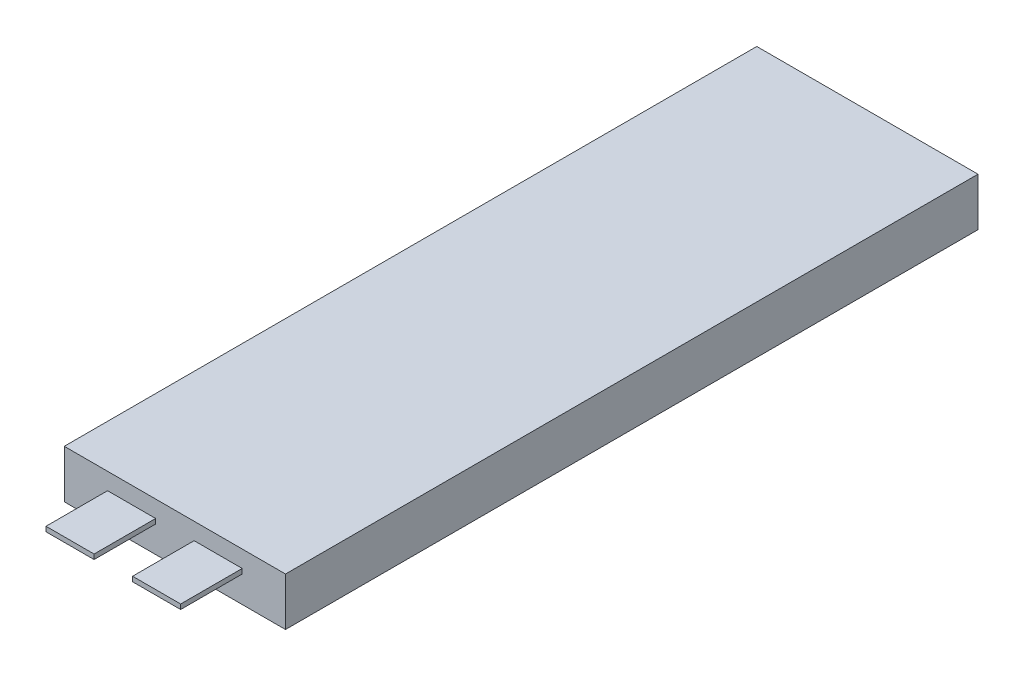
ISO-10303-21;
HEADER;
FILE_DESCRIPTION(('STEP AP214'),'2;1');
FILE_NAME('part.step','',(''),(''),'','','');
FILE_SCHEMA(('AUTOMOTIVE_DESIGN { 1 0 10303 214 1 1 1 1 }'));
ENDSEC;
DATA;
#1=APPLICATION_CONTEXT('core data for automotive mechanical design processes');
#2=APPLICATION_PROTOCOL_DEFINITION('international standard','automotive_design',2000,#1);
#3=PRODUCT_CONTEXT('',#1,'mechanical');
#4=PRODUCT('Part','Part','',(#3));
#5=PRODUCT_RELATED_PRODUCT_CATEGORY('part','',(#4));
#6=PRODUCT_DEFINITION_FORMATION('','',#4);
#7=PRODUCT_DEFINITION_CONTEXT('part definition',#1,'design');
#8=PRODUCT_DEFINITION('design','',#6,#7);
#9=PRODUCT_DEFINITION_SHAPE('','',#8);
#10=(LENGTH_UNIT() NAMED_UNIT(*) SI_UNIT(.MILLI.,.METRE.));
#11=(NAMED_UNIT(*) PLANE_ANGLE_UNIT() SI_UNIT($,.RADIAN.));
#12=(NAMED_UNIT(*) SI_UNIT($,.STERADIAN.) SOLID_ANGLE_UNIT());
#13=UNCERTAINTY_MEASURE_WITH_UNIT(LENGTH_MEASURE(1.E-05),#10,'distance_accuracy_value','');
#14=(GEOMETRIC_REPRESENTATION_CONTEXT(3) GLOBAL_UNCERTAINTY_ASSIGNED_CONTEXT((#13)) GLOBAL_UNIT_ASSIGNED_CONTEXT((#10,
#11,#12)) REPRESENTATION_CONTEXT('',''));
#15=CARTESIAN_POINT('',(0.,0.,0.));
#16=DIRECTION('',(0.,0.,1.));
#17=DIRECTION('',(1.,0.,0.));
#18=AXIS2_PLACEMENT_3D('',#15,#16,#17);
#19=CARTESIAN_POINT('',(23.,10.,72.));
#20=DIRECTION('',(0.,0.,1.));
#21=DIRECTION('',(1.,0.,0.));
#22=AXIS2_PLACEMENT_3D('',#19,#20,#21);
#23=PLANE('',#22);
#24=DIRECTION('',(-1.,0.,0.));
#25=VECTOR('',#24,1.);
#26=CARTESIAN_POINT('',(23.,0.,72.));
#27=LINE('',#26,#25);
#28=CARTESIAN_POINT('',(23.,0.,72.));
#29=VERTEX_POINT('',#28);
#30=CARTESIAN_POINT('',(-23.,0.,72.));
#31=VERTEX_POINT('',#30);
#32=EDGE_CURVE('E209',#29,#31,#27,.T.);
#33=ORIENTED_EDGE('',*,*,#32,.F.);
#34=DIRECTION('',(0.,-1.,0.));
#35=VECTOR('',#34,1.);
#36=CARTESIAN_POINT('',(23.,10.,72.));
#37=LINE('',#36,#35);
#38=CARTESIAN_POINT('',(23.,10.,72.));
#39=VERTEX_POINT('',#38);
#40=EDGE_CURVE('E49',#39,#29,#37,.T.);
#41=ORIENTED_EDGE('',*,*,#40,.F.);
#42=DIRECTION('',(-1.,0.,0.));
#43=VECTOR('',#42,1.);
#44=CARTESIAN_POINT('',(23.,10.,72.));
#45=LINE('',#44,#43);
#46=CARTESIAN_POINT('',(-23.,10.,72.));
#47=VERTEX_POINT('',#46);
#48=EDGE_CURVE('E216',#39,#47,#45,.T.);
#49=ORIENTED_EDGE('',*,*,#48,.T.);
#50=DIRECTION('',(0.,-1.,0.));
#51=VECTOR('',#50,1.);
#52=CARTESIAN_POINT('',(-23.,10.,72.));
#53=LINE('',#52,#51);
#54=EDGE_CURVE('E11',#47,#31,#53,.T.);
#55=ORIENTED_EDGE('',*,*,#54,.T.);
#56=EDGE_LOOP('',(#33,#41,#49,#55));
#57=FACE_BOUND('',#56,.T.);
#58=DIRECTION('',(1.,0.,0.));
#59=VECTOR('',#58,1.);
#60=CARTESIAN_POINT('',(-14.,5.5,72.));
#61=LINE('',#60,#59);
#62=CARTESIAN_POINT('',(-14.,5.5,72.));
#63=VERTEX_POINT('',#62);
#64=CARTESIAN_POINT('',(-4.,5.49999999999999,72.));
#65=VERTEX_POINT('',#64);
#66=EDGE_CURVE('E164',#63,#65,#61,.T.);
#67=ORIENTED_EDGE('',*,*,#66,.F.);
#68=DIRECTION('',(0.,-1.,0.));
#69=VECTOR('',#68,1.);
#70=CARTESIAN_POINT('',(-14.,5.5,72.));
#71=LINE('',#70,#69);
#72=CARTESIAN_POINT('',(-14.,6.5,72.));
#73=VERTEX_POINT('',#72);
#74=EDGE_CURVE('E159',#73,#63,#71,.T.);
#75=ORIENTED_EDGE('',*,*,#74,.F.);
#76=DIRECTION('',(-1.,0.,0.));
#77=VECTOR('',#76,1.);
#78=CARTESIAN_POINT('',(-14.,6.5,72.));
#79=LINE('',#78,#77);
#80=CARTESIAN_POINT('',(-4.,6.5,72.));
#81=VERTEX_POINT('',#80);
#82=EDGE_CURVE('E174',#81,#73,#79,.T.);
#83=ORIENTED_EDGE('',*,*,#82,.F.);
#84=DIRECTION('',(0.,1.,0.));
#85=VECTOR('',#84,1.);
#86=CARTESIAN_POINT('',(-4.,5.49999999999999,72.));
#87=LINE('',#86,#85);
#88=EDGE_CURVE('E186',#65,#81,#87,.T.);
#89=ORIENTED_EDGE('',*,*,#88,.F.);
#90=EDGE_LOOP('',(#67,#75,#83,#89));
#91=FACE_BOUND('',#90,.T.);
#92=DIRECTION('',(0.,1.,0.));
#93=VECTOR('',#92,1.);
#94=CARTESIAN_POINT('',(14.,5.5,72.));
#95=LINE('',#94,#93);
#96=CARTESIAN_POINT('',(14.,5.5,72.));
#97=VERTEX_POINT('',#96);
#98=CARTESIAN_POINT('',(14.,6.5,72.));
#99=VERTEX_POINT('',#98);
#100=EDGE_CURVE('E405',#97,#99,#95,.T.);
#101=ORIENTED_EDGE('',*,*,#100,.F.);
#102=DIRECTION('',(1.,0.,0.));
#103=VECTOR('',#102,1.);
#104=CARTESIAN_POINT('',(14.,5.5,72.));
#105=LINE('',#104,#103);
#106=CARTESIAN_POINT('',(4.,5.49999999999999,72.));
#107=VERTEX_POINT('',#106);
#108=EDGE_CURVE('E156',#107,#97,#105,.T.);
#109=ORIENTED_EDGE('',*,*,#108,.F.);
#110=DIRECTION('',(0.,-1.,0.));
#111=VECTOR('',#110,1.);
#112=CARTESIAN_POINT('',(4.,5.49999999999999,72.));
#113=LINE('',#112,#111);
#114=CARTESIAN_POINT('',(4.,6.5,72.));
#115=VERTEX_POINT('',#114);
#116=EDGE_CURVE('E152',#115,#107,#113,.T.);
#117=ORIENTED_EDGE('',*,*,#116,.F.);
#118=DIRECTION('',(-1.,0.,0.));
#119=VECTOR('',#118,1.);
#120=CARTESIAN_POINT('',(14.,6.5,72.));
#121=LINE('',#120,#119);
#122=EDGE_CURVE('E401',#99,#115,#121,.T.);
#123=ORIENTED_EDGE('',*,*,#122,.F.);
#124=EDGE_LOOP('',(#101,#109,#117,#123));
#125=FACE_BOUND('',#124,.T.);
#126=ADVANCED_FACE('F39',(#57,#91,#125),#23,.T.);
#127=CARTESIAN_POINT('',(-23.,10.,72.));
#128=DIRECTION('',(-1.,0.,0.));
#129=DIRECTION('',(0.,0.,1.));
#130=AXIS2_PLACEMENT_3D('',#127,#128,#129);
#131=PLANE('',#130);
#132=DIRECTION('',(0.,0.,-1.));
#133=VECTOR('',#132,1.);
#134=CARTESIAN_POINT('',(-23.,0.,72.));
#135=LINE('',#134,#133);
#136=CARTESIAN_POINT('',(-23.,0.,-72.));
#137=VERTEX_POINT('',#136);
#138=EDGE_CURVE('E203',#31,#137,#135,.T.);
#139=ORIENTED_EDGE('',*,*,#138,.F.);
#140=ORIENTED_EDGE('',*,*,#54,.F.);
#141=DIRECTION('',(0.,0.,-1.));
#142=VECTOR('',#141,1.);
#143=CARTESIAN_POINT('',(-23.,10.,72.));
#144=LINE('',#143,#142);
#145=CARTESIAN_POINT('',(-23.,10.,-72.));
#146=VERTEX_POINT('',#145);
#147=EDGE_CURVE('E204',#47,#146,#144,.T.);
#148=ORIENTED_EDGE('',*,*,#147,.T.);
#149=DIRECTION('',(0.,-1.,0.));
#150=VECTOR('',#149,1.);
#151=CARTESIAN_POINT('',(-23.,10.,-72.));
#152=LINE('',#151,#150);
#153=EDGE_CURVE('E43',#146,#137,#152,.T.);
#154=ORIENTED_EDGE('',*,*,#153,.T.);
#155=EDGE_LOOP('',(#139,#140,#148,#154));
#156=FACE_BOUND('',#155,.T.);
#157=ADVANCED_FACE('F41',(#156),#131,.T.);
#158=CARTESIAN_POINT('',(23.,10.,72.));
#159=DIRECTION('',(-1.,0.,0.));
#160=DIRECTION('',(0.,0.,1.));
#161=AXIS2_PLACEMENT_3D('',#158,#159,#160);
#162=PLANE('',#161);
#163=DIRECTION('',(0.,0.,-1.));
#164=VECTOR('',#163,1.);
#165=CARTESIAN_POINT('',(23.,0.,72.));
#166=LINE('',#165,#164);
#167=CARTESIAN_POINT('',(23.,0.,-72.));
#168=VERTEX_POINT('',#167);
#169=EDGE_CURVE('E227',#29,#168,#166,.T.);
#170=ORIENTED_EDGE('',*,*,#169,.T.);
#171=DIRECTION('',(0.,-1.,0.));
#172=VECTOR('',#171,1.);
#173=CARTESIAN_POINT('',(23.,10.,-72.));
#174=LINE('',#173,#172);
#175=CARTESIAN_POINT('',(23.,10.,-72.));
#176=VERTEX_POINT('',#175);
#177=EDGE_CURVE('E235',#176,#168,#174,.T.);
#178=ORIENTED_EDGE('',*,*,#177,.F.);
#179=DIRECTION('',(0.,0.,-1.));
#180=VECTOR('',#179,1.);
#181=CARTESIAN_POINT('',(23.,10.,72.));
#182=LINE('',#181,#180);
#183=EDGE_CURVE('E213',#39,#176,#182,.T.);
#184=ORIENTED_EDGE('',*,*,#183,.F.);
#185=ORIENTED_EDGE('',*,*,#40,.T.);
#186=EDGE_LOOP('',(#170,#178,#184,#185));
#187=FACE_BOUND('',#186,.T.);
#188=ADVANCED_FACE('F257',(#187),#162,.F.);
#189=CARTESIAN_POINT('',(-23.,10.,-72.));
#190=DIRECTION('',(0.,0.,-1.));
#191=DIRECTION('',(-1.,0.,0.));
#192=AXIS2_PLACEMENT_3D('',#189,#190,#191);
#193=PLANE('',#192);
#194=DIRECTION('',(1.,0.,0.));
#195=VECTOR('',#194,1.);
#196=CARTESIAN_POINT('',(-23.,0.,-72.));
#197=LINE('',#196,#195);
#198=EDGE_CURVE('E223',#137,#168,#197,.T.);
#199=ORIENTED_EDGE('',*,*,#198,.F.);
#200=ORIENTED_EDGE('',*,*,#153,.F.);
#201=DIRECTION('',(1.,0.,0.));
#202=VECTOR('',#201,1.);
#203=CARTESIAN_POINT('',(-23.,10.,-72.));
#204=LINE('',#203,#202);
#205=EDGE_CURVE('E208',#146,#176,#204,.T.);
#206=ORIENTED_EDGE('',*,*,#205,.T.);
#207=ORIENTED_EDGE('',*,*,#177,.T.);
#208=EDGE_LOOP('',(#199,#200,#206,#207));
#209=FACE_BOUND('',#208,.T.);
#210=ADVANCED_FACE('F245',(#209),#193,.T.);
#211=CARTESIAN_POINT('',(0.,10.,0.));
#212=DIRECTION('',(0.,-1.,0.));
#213=DIRECTION('',(0.,0.,-1.));
#214=AXIS2_PLACEMENT_3D('',#211,#212,#213);
#215=PLANE('',#214);
#216=ORIENTED_EDGE('',*,*,#147,.F.);
#217=ORIENTED_EDGE('',*,*,#48,.F.);
#218=ORIENTED_EDGE('',*,*,#183,.T.);
#219=ORIENTED_EDGE('',*,*,#205,.F.);
#220=EDGE_LOOP('',(#216,#217,#218,#219));
#221=FACE_BOUND('',#220,.T.);
#222=ADVANCED_FACE('F255',(#221),#215,.F.);
#223=CARTESIAN_POINT('',(0.,0.,0.));
#224=DIRECTION('',(0.,-1.,0.));
#225=DIRECTION('',(0.,0.,-1.));
#226=AXIS2_PLACEMENT_3D('',#223,#224,#225);
#227=PLANE('',#226);
#228=ORIENTED_EDGE('',*,*,#138,.T.);
#229=ORIENTED_EDGE('',*,*,#198,.T.);
#230=ORIENTED_EDGE('',*,*,#169,.F.);
#231=ORIENTED_EDGE('',*,*,#32,.T.);
#232=EDGE_LOOP('',(#228,#229,#230,#231));
#233=FACE_BOUND('',#232,.T.);
#234=ADVANCED_FACE('F248',(#233),#227,.T.);
#235=CARTESIAN_POINT('',(-14.,5.5,84.8));
#236=DIRECTION('',(1.,0.,0.));
#237=DIRECTION('',(0.,0.,-1.));
#238=AXIS2_PLACEMENT_3D('',#235,#236,#237);
#239=PLANE('',#238);
#240=ORIENTED_EDGE('',*,*,#74,.T.);
#241=DIRECTION('',(0.,0.,-1.));
#242=VECTOR('',#241,1.);
#243=CARTESIAN_POINT('',(-14.,5.5,84.8));
#244=LINE('',#243,#242);
#245=CARTESIAN_POINT('',(-14.,5.5,84.8));
#246=VERTEX_POINT('',#245);
#247=EDGE_CURVE('E200',#246,#63,#244,.T.);
#248=ORIENTED_EDGE('',*,*,#247,.F.);
#249=DIRECTION('',(0.,-1.,0.));
#250=VECTOR('',#249,1.);
#251=CARTESIAN_POINT('',(-14.,5.5,84.8));
#252=LINE('',#251,#250);
#253=CARTESIAN_POINT('',(-14.,6.5,84.8));
#254=VERTEX_POINT('',#253);
#255=EDGE_CURVE('E169',#254,#246,#252,.T.);
#256=ORIENTED_EDGE('',*,*,#255,.F.);
#257=DIRECTION('',(0.,0.,-1.));
#258=VECTOR('',#257,1.);
#259=CARTESIAN_POINT('',(-14.,6.5,84.8));
#260=LINE('',#259,#258);
#261=EDGE_CURVE('E182',#254,#73,#260,.T.);
#262=ORIENTED_EDGE('',*,*,#261,.T.);
#263=EDGE_LOOP('',(#240,#248,#256,#262));
#264=FACE_BOUND('',#263,.T.);
#265=ADVANCED_FACE('F273',(#264),#239,.F.);
#266=CARTESIAN_POINT('',(-14.,5.5,84.8));
#267=DIRECTION('',(0.,1.,0.));
#268=DIRECTION('',(-1.,0.,0.));
#269=AXIS2_PLACEMENT_3D('',#266,#267,#268);
#270=PLANE('',#269);
#271=ORIENTED_EDGE('',*,*,#66,.T.);
#272=DIRECTION('',(0.,0.,-1.));
#273=VECTOR('',#272,1.);
#274=CARTESIAN_POINT('',(-4.,5.49999999999999,84.8));
#275=LINE('',#274,#273);
#276=CARTESIAN_POINT('',(-4.,5.49999999999999,84.8));
#277=VERTEX_POINT('',#276);
#278=EDGE_CURVE('E196',#277,#65,#275,.T.);
#279=ORIENTED_EDGE('',*,*,#278,.F.);
#280=DIRECTION('',(1.,0.,0.));
#281=VECTOR('',#280,1.);
#282=CARTESIAN_POINT('',(-14.,5.5,84.8));
#283=LINE('',#282,#281);
#284=EDGE_CURVE('E173',#246,#277,#283,.T.);
#285=ORIENTED_EDGE('',*,*,#284,.F.);
#286=ORIENTED_EDGE('',*,*,#247,.T.);
#287=EDGE_LOOP('',(#271,#279,#285,#286));
#288=FACE_BOUND('',#287,.T.);
#289=ADVANCED_FACE('F278',(#288),#270,.F.);
#290=CARTESIAN_POINT('',(-4.,5.49999999999999,84.8));
#291=DIRECTION('',(-1.,0.,0.));
#292=DIRECTION('',(0.,0.,1.));
#293=AXIS2_PLACEMENT_3D('',#290,#291,#292);
#294=PLANE('',#293);
#295=ORIENTED_EDGE('',*,*,#88,.T.);
#296=DIRECTION('',(0.,0.,-1.));
#297=VECTOR('',#296,1.);
#298=CARTESIAN_POINT('',(-4.,6.5,84.8));
#299=LINE('',#298,#297);
#300=CARTESIAN_POINT('',(-4.,6.5,84.8));
#301=VERTEX_POINT('',#300);
#302=EDGE_CURVE('E65',#301,#81,#299,.T.);
#303=ORIENTED_EDGE('',*,*,#302,.F.);
#304=DIRECTION('',(0.,1.,0.));
#305=VECTOR('',#304,1.);
#306=CARTESIAN_POINT('',(-4.,5.49999999999999,84.8));
#307=LINE('',#306,#305);
#308=EDGE_CURVE('E177',#277,#301,#307,.T.);
#309=ORIENTED_EDGE('',*,*,#308,.F.);
#310=ORIENTED_EDGE('',*,*,#278,.T.);
#311=EDGE_LOOP('',(#295,#303,#309,#310));
#312=FACE_BOUND('',#311,.T.);
#313=ADVANCED_FACE('F282',(#312),#294,.F.);
#314=CARTESIAN_POINT('',(-14.,6.5,84.8));
#315=DIRECTION('',(0.,-1.,0.));
#316=DIRECTION('',(1.,0.,0.));
#317=AXIS2_PLACEMENT_3D('',#314,#315,#316);
#318=PLANE('',#317);
#319=ORIENTED_EDGE('',*,*,#82,.T.);
#320=ORIENTED_EDGE('',*,*,#261,.F.);
#321=DIRECTION('',(-1.,0.,0.));
#322=VECTOR('',#321,1.);
#323=CARTESIAN_POINT('',(-14.,6.5,84.8));
#324=LINE('',#323,#322);
#325=EDGE_CURVE('E180',#301,#254,#324,.T.);
#326=ORIENTED_EDGE('',*,*,#325,.F.);
#327=ORIENTED_EDGE('',*,*,#302,.T.);
#328=EDGE_LOOP('',(#319,#320,#326,#327));
#329=FACE_BOUND('',#328,.T.);
#330=ADVANCED_FACE('F286',(#329),#318,.F.);
#331=CARTESIAN_POINT('',(0.,0.,84.8));
#332=DIRECTION('',(0.,0.,-1.));
#333=DIRECTION('',(-1.,0.,0.));
#334=AXIS2_PLACEMENT_3D('',#331,#332,#333);
#335=PLANE('',#334);
#336=ORIENTED_EDGE('',*,*,#255,.T.);
#337=ORIENTED_EDGE('',*,*,#284,.T.);
#338=ORIENTED_EDGE('',*,*,#308,.T.);
#339=ORIENTED_EDGE('',*,*,#325,.T.);
#340=EDGE_LOOP('',(#336,#337,#338,#339));
#341=FACE_BOUND('',#340,.T.);
#342=ADVANCED_FACE('F290',(#341),#335,.F.);
#343=CARTESIAN_POINT('',(14.,5.5,84.8));
#344=DIRECTION('',(0.,1.,0.));
#345=DIRECTION('',(-1.,0.,0.));
#346=AXIS2_PLACEMENT_3D('',#343,#344,#345);
#347=PLANE('',#346);
#348=ORIENTED_EDGE('',*,*,#108,.T.);
#349=DIRECTION('',(0.,0.,-1.));
#350=VECTOR('',#349,1.);
#351=CARTESIAN_POINT('',(14.,5.5,84.8));
#352=LINE('',#351,#350);
#353=CARTESIAN_POINT('',(14.,5.5,84.8));
#354=VERTEX_POINT('',#353);
#355=EDGE_CURVE('E135',#354,#97,#352,.T.);
#356=ORIENTED_EDGE('',*,*,#355,.F.);
#357=DIRECTION('',(1.,0.,0.));
#358=VECTOR('',#357,1.);
#359=CARTESIAN_POINT('',(14.,5.5,84.8));
#360=LINE('',#359,#358);
#361=CARTESIAN_POINT('',(4.,5.49999999999999,84.8));
#362=VERTEX_POINT('',#361);
#363=EDGE_CURVE('E143',#362,#354,#360,.T.);
#364=ORIENTED_EDGE('',*,*,#363,.F.);
#365=DIRECTION('',(0.,0.,-1.));
#366=VECTOR('',#365,1.);
#367=CARTESIAN_POINT('',(4.,5.49999999999999,84.8));
#368=LINE('',#367,#366);
#369=EDGE_CURVE('E397',#362,#107,#368,.T.);
#370=ORIENTED_EDGE('',*,*,#369,.T.);
#371=EDGE_LOOP('',(#348,#356,#364,#370));
#372=FACE_BOUND('',#371,.T.);
#373=ADVANCED_FACE('F154',(#372),#347,.F.);
#374=CARTESIAN_POINT('',(14.,5.5,84.8));
#375=DIRECTION('',(-1.,0.,0.));
#376=DIRECTION('',(0.,0.,1.));
#377=AXIS2_PLACEMENT_3D('',#374,#375,#376);
#378=PLANE('',#377);
#379=ORIENTED_EDGE('',*,*,#100,.T.);
#380=DIRECTION('',(0.,0.,-1.));
#381=VECTOR('',#380,1.);
#382=CARTESIAN_POINT('',(14.,6.5,84.8));
#383=LINE('',#382,#381);
#384=CARTESIAN_POINT('',(14.,6.5,84.8));
#385=VERTEX_POINT('',#384);
#386=EDGE_CURVE('E138',#385,#99,#383,.T.);
#387=ORIENTED_EDGE('',*,*,#386,.F.);
#388=DIRECTION('',(0.,1.,0.));
#389=VECTOR('',#388,1.);
#390=CARTESIAN_POINT('',(14.,5.5,84.8));
#391=LINE('',#390,#389);
#392=EDGE_CURVE('E131',#354,#385,#391,.T.);
#393=ORIENTED_EDGE('',*,*,#392,.F.);
#394=ORIENTED_EDGE('',*,*,#355,.T.);
#395=EDGE_LOOP('',(#379,#387,#393,#394));
#396=FACE_BOUND('',#395,.T.);
#397=ADVANCED_FACE('F133',(#396),#378,.F.);
#398=CARTESIAN_POINT('',(14.,6.5,84.8));
#399=DIRECTION('',(0.,-1.,0.));
#400=DIRECTION('',(1.,0.,0.));
#401=AXIS2_PLACEMENT_3D('',#398,#399,#400);
#402=PLANE('',#401);
#403=ORIENTED_EDGE('',*,*,#122,.T.);
#404=DIRECTION('',(0.,0.,-1.));
#405=VECTOR('',#404,1.);
#406=CARTESIAN_POINT('',(4.,6.5,84.8));
#407=LINE('',#406,#405);
#408=CARTESIAN_POINT('',(4.,6.5,84.8));
#409=VERTEX_POINT('',#408);
#410=EDGE_CURVE('E57',#409,#115,#407,.T.);
#411=ORIENTED_EDGE('',*,*,#410,.F.);
#412=DIRECTION('',(-1.,0.,0.));
#413=VECTOR('',#412,1.);
#414=CARTESIAN_POINT('',(14.,6.5,84.8));
#415=LINE('',#414,#413);
#416=EDGE_CURVE('E142',#385,#409,#415,.T.);
#417=ORIENTED_EDGE('',*,*,#416,.F.);
#418=ORIENTED_EDGE('',*,*,#386,.T.);
#419=EDGE_LOOP('',(#403,#411,#417,#418));
#420=FACE_BOUND('',#419,.T.);
#421=ADVANCED_FACE('F298',(#420),#402,.F.);
#422=CARTESIAN_POINT('',(4.,5.49999999999999,84.8));
#423=DIRECTION('',(1.,0.,0.));
#424=DIRECTION('',(0.,0.,-1.));
#425=AXIS2_PLACEMENT_3D('',#422,#423,#424);
#426=PLANE('',#425);
#427=ORIENTED_EDGE('',*,*,#116,.T.);
#428=ORIENTED_EDGE('',*,*,#369,.F.);
#429=DIRECTION('',(0.,-1.,0.));
#430=VECTOR('',#429,1.);
#431=CARTESIAN_POINT('',(4.,5.49999999999999,84.8));
#432=LINE('',#431,#430);
#433=EDGE_CURVE('E147',#409,#362,#432,.T.);
#434=ORIENTED_EDGE('',*,*,#433,.F.);
#435=ORIENTED_EDGE('',*,*,#410,.T.);
#436=EDGE_LOOP('',(#427,#428,#434,#435));
#437=FACE_BOUND('',#436,.T.);
#438=ADVANCED_FACE('F301',(#437),#426,.F.);
#439=CARTESIAN_POINT('',(0.,0.,84.8));
#440=DIRECTION('',(0.,0.,-1.));
#441=DIRECTION('',(-1.,0.,0.));
#442=AXIS2_PLACEMENT_3D('',#439,#440,#441);
#443=PLANE('',#442);
#444=ORIENTED_EDGE('',*,*,#363,.T.);
#445=ORIENTED_EDGE('',*,*,#392,.T.);
#446=ORIENTED_EDGE('',*,*,#416,.T.);
#447=ORIENTED_EDGE('',*,*,#433,.T.);
#448=EDGE_LOOP('',(#444,#445,#446,#447));
#449=FACE_BOUND('',#448,.T.);
#450=ADVANCED_FACE('F146',(#449),#443,.F.);
#451=CLOSED_SHELL('',(#126,#157,#188,#210,#222,#234,#265,#289,#313,#330,#342,#373,#397,#421,
#438,#450));
#452=MANIFOLD_SOLID_BREP('B2',#451);
#453=ADVANCED_BREP_SHAPE_REPRESENTATION('',(#18,#452),#14);
#454=SHAPE_DEFINITION_REPRESENTATION(#9,#453);
ENDSEC;
END-ISO-10303-21;
